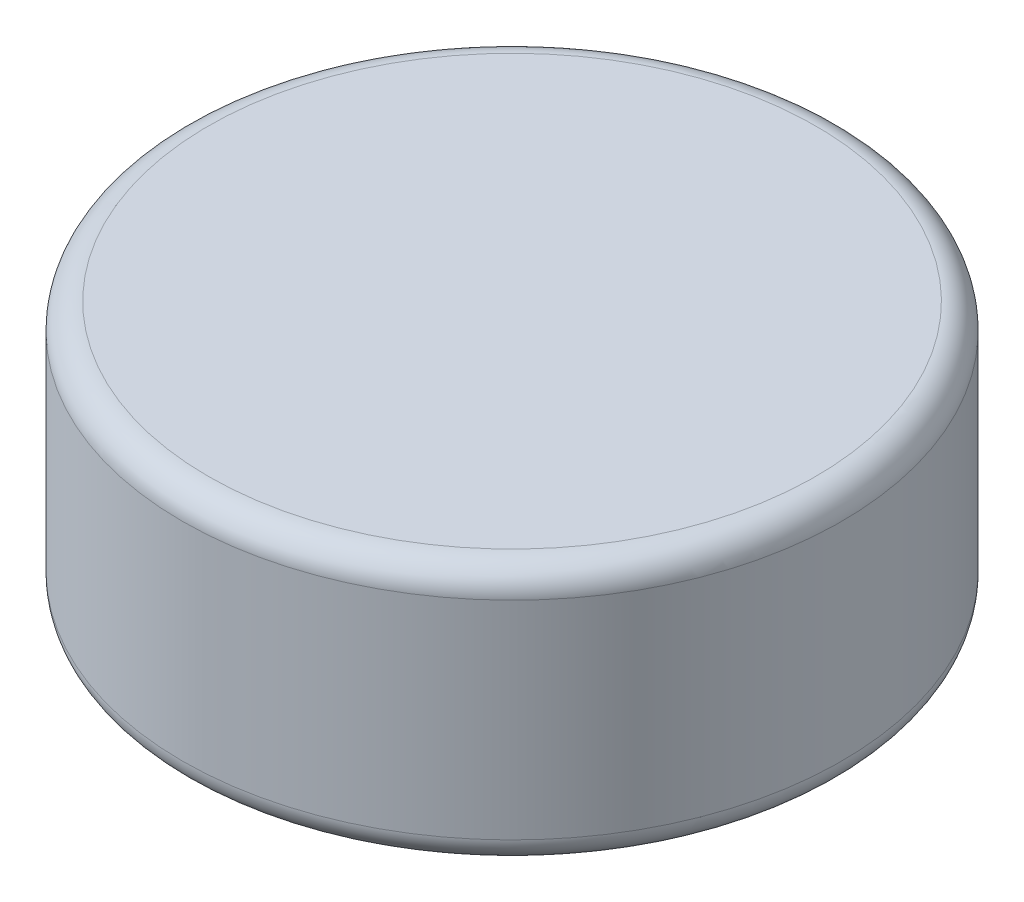
ISO-10303-21;
HEADER;
FILE_DESCRIPTION(('STEP AP214'),'2;1');
FILE_NAME('part.step','',(''),(''),'','','');
FILE_SCHEMA(('AUTOMOTIVE_DESIGN { 1 0 10303 214 1 1 1 1 }'));
ENDSEC;
DATA;
#1=APPLICATION_CONTEXT('core data for automotive mechanical design processes');
#2=APPLICATION_PROTOCOL_DEFINITION('international standard','automotive_design',2000,#1);
#3=PRODUCT_CONTEXT('',#1,'mechanical');
#4=PRODUCT('Part','Part','',(#3));
#5=PRODUCT_RELATED_PRODUCT_CATEGORY('part','',(#4));
#6=PRODUCT_DEFINITION_FORMATION('','',#4);
#7=PRODUCT_DEFINITION_CONTEXT('part definition',#1,'design');
#8=PRODUCT_DEFINITION('design','',#6,#7);
#9=PRODUCT_DEFINITION_SHAPE('','',#8);
#10=(LENGTH_UNIT() NAMED_UNIT(*) SI_UNIT(.MILLI.,.METRE.));
#11=(NAMED_UNIT(*) PLANE_ANGLE_UNIT() SI_UNIT($,.RADIAN.));
#12=(NAMED_UNIT(*) SI_UNIT($,.STERADIAN.) SOLID_ANGLE_UNIT());
#13=UNCERTAINTY_MEASURE_WITH_UNIT(LENGTH_MEASURE(1.E-05),#10,'distance_accuracy_value','');
#14=(GEOMETRIC_REPRESENTATION_CONTEXT(3) GLOBAL_UNCERTAINTY_ASSIGNED_CONTEXT((#13)) GLOBAL_UNIT_ASSIGNED_CONTEXT((#10,
#11,#12)) REPRESENTATION_CONTEXT('',''));
#15=CARTESIAN_POINT('',(0.,0.,0.));
#16=DIRECTION('',(0.,0.,1.));
#17=DIRECTION('',(1.,0.,0.));
#18=AXIS2_PLACEMENT_3D('',#15,#16,#17);
#19=CARTESIAN_POINT('',(0.,100.,0.));
#20=DIRECTION('',(0.,-1.,0.));
#21=DIRECTION('',(0.,0.,-1.));
#22=AXIS2_PLACEMENT_3D('',#19,#20,#21);
#23=CYLINDRICAL_SURFACE('',#22,127.);
#24=CARTESIAN_POINT('',(0.,9.99999999999999,0.));
#25=DIRECTION('',(0.,1.,0.));
#26=DIRECTION('',(0.,0.,1.));
#27=AXIS2_PLACEMENT_3D('',#24,#25,#26);
#28=CIRCLE('',#27,127.);
#29=CARTESIAN_POINT('',(0.,9.99999999999999,127.));
#30=VERTEX_POINT('',#29);
#31=EDGE_CURVE('E59',#30,#30,#28,.T.);
#32=ORIENTED_EDGE('',*,*,#31,.T.);
#33=EDGE_LOOP('',(#32));
#34=FACE_BOUND('',#33,.T.);
#35=CARTESIAN_POINT('',(0.,90.,0.));
#36=DIRECTION('',(0.,1.,0.));
#37=DIRECTION('',(0.,0.,1.));
#38=AXIS2_PLACEMENT_3D('',#35,#36,#37);
#39=CIRCLE('',#38,127.);
#40=CARTESIAN_POINT('',(0.,90.,127.));
#41=VERTEX_POINT('',#40);
#42=EDGE_CURVE('E62',#41,#41,#39,.F.);
#43=ORIENTED_EDGE('',*,*,#42,.T.);
#44=EDGE_LOOP('',(#43));
#45=FACE_BOUND('',#44,.T.);
#46=ADVANCED_FACE('F39',(#34,#45),#23,.T.);
#47=CARTESIAN_POINT('',(0.,100.,0.));
#48=DIRECTION('',(0.,1.,0.));
#49=DIRECTION('',(0.,0.,1.));
#50=AXIS2_PLACEMENT_3D('',#47,#48,#49);
#51=PLANE('',#50);
#52=CARTESIAN_POINT('',(0.,100.,0.));
#53=DIRECTION('',(0.,1.,0.));
#54=DIRECTION('',(0.,0.,1.));
#55=AXIS2_PLACEMENT_3D('',#52,#53,#54);
#56=CIRCLE('',#55,117.);
#57=CARTESIAN_POINT('',(0.,100.,117.));
#58=VERTEX_POINT('',#57);
#59=EDGE_CURVE('E50',#58,#58,#56,.T.);
#60=ORIENTED_EDGE('',*,*,#59,.T.);
#61=EDGE_LOOP('',(#60));
#62=FACE_BOUND('',#61,.T.);
#63=ADVANCED_FACE('F86',(#62),#51,.T.);
#64=CARTESIAN_POINT('',(0.,0.,0.));
#65=DIRECTION('',(0.,1.,0.));
#66=DIRECTION('',(0.,0.,1.));
#67=AXIS2_PLACEMENT_3D('',#64,#65,#66);
#68=PLANE('',#67);
#69=CARTESIAN_POINT('',(0.,0.,0.));
#70=DIRECTION('',(0.,1.,0.));
#71=DIRECTION('',(0.,0.,1.));
#72=AXIS2_PLACEMENT_3D('',#69,#70,#71);
#73=CIRCLE('',#72,74.5);
#74=CARTESIAN_POINT('',(0.,0.,74.5));
#75=VERTEX_POINT('',#74);
#76=EDGE_CURVE('E10',#75,#75,#73,.T.);
#77=ORIENTED_EDGE('',*,*,#76,.T.);
#78=EDGE_LOOP('',(#77));
#79=FACE_BOUND('',#78,.T.);
#80=CARTESIAN_POINT('',(0.,0.,0.));
#81=DIRECTION('',(0.,1.,0.));
#82=DIRECTION('',(0.,0.,1.));
#83=AXIS2_PLACEMENT_3D('',#80,#81,#82);
#84=CIRCLE('',#83,117.);
#85=CARTESIAN_POINT('',(0.,0.,117.));
#86=VERTEX_POINT('',#85);
#87=EDGE_CURVE('E54',#86,#86,#84,.F.);
#88=ORIENTED_EDGE('',*,*,#87,.T.);
#89=EDGE_LOOP('',(#88));
#90=FACE_BOUND('',#89,.T.);
#91=ADVANCED_FACE('F92',(#79,#90),#68,.F.);
#92=CARTESIAN_POINT('',(0.,9.99999999999999,0.));
#93=DIRECTION('',(0.,1.,0.));
#94=DIRECTION('',(0.,0.,1.));
#95=AXIS2_PLACEMENT_3D('',#92,#93,#94);
#96=TOROIDAL_SURFACE('',#95,117.,10.);
#97=ORIENTED_EDGE('',*,*,#87,.F.);
#98=EDGE_LOOP('',(#97));
#99=FACE_BOUND('',#98,.T.);
#100=ORIENTED_EDGE('',*,*,#31,.F.);
#101=EDGE_LOOP('',(#100));
#102=FACE_BOUND('',#101,.T.);
#103=ADVANCED_FACE('F82',(#99,#102),#96,.T.);
#104=CARTESIAN_POINT('',(0.,90.,0.));
#105=DIRECTION('',(0.,1.,0.));
#106=DIRECTION('',(0.,0.,1.));
#107=AXIS2_PLACEMENT_3D('',#104,#105,#106);
#108=TOROIDAL_SURFACE('',#107,117.,10.);
#109=ORIENTED_EDGE('',*,*,#42,.F.);
#110=EDGE_LOOP('',(#109));
#111=FACE_BOUND('',#110,.T.);
#112=ORIENTED_EDGE('',*,*,#59,.F.);
#113=EDGE_LOOP('',(#112));
#114=FACE_BOUND('',#113,.T.);
#115=ADVANCED_FACE('F73',(#111,#114),#108,.T.);
#116=CARTESIAN_POINT('',(0.,39.,0.));
#117=DIRECTION('',(0.,-1.,0.));
#118=DIRECTION('',(0.,0.,-1.));
#119=AXIS2_PLACEMENT_3D('',#116,#117,#118);
#120=CYLINDRICAL_SURFACE('',#119,64.5);
#121=CARTESIAN_POINT('',(0.,10.,0.));
#122=DIRECTION('',(0.,1.,0.));
#123=DIRECTION('',(0.,0.,1.));
#124=AXIS2_PLACEMENT_3D('',#121,#122,#123);
#125=CIRCLE('',#124,64.5);
#126=CARTESIAN_POINT('',(0.,10.,64.5));
#127=VERTEX_POINT('',#126);
#128=EDGE_CURVE('E46',#127,#127,#125,.F.);
#129=ORIENTED_EDGE('',*,*,#128,.T.);
#130=EDGE_LOOP('',(#129));
#131=FACE_BOUND('',#130,.T.);
#132=CARTESIAN_POINT('',(0.,39.,0.));
#133=DIRECTION('',(0.,-1.,0.));
#134=DIRECTION('',(0.,0.,-1.));
#135=AXIS2_PLACEMENT_3D('',#132,#133,#134);
#136=CIRCLE('',#135,64.5);
#137=CARTESIAN_POINT('',(0.,39.,-64.5));
#138=VERTEX_POINT('',#137);
#139=EDGE_CURVE('E65',#138,#138,#136,.T.);
#140=ORIENTED_EDGE('',*,*,#139,.F.);
#141=EDGE_LOOP('',(#140));
#142=FACE_BOUND('',#141,.T.);
#143=ADVANCED_FACE('F71',(#131,#142),#120,.F.);
#144=CARTESIAN_POINT('',(0.,39.,0.));
#145=DIRECTION('',(0.,-1.,0.));
#146=DIRECTION('',(0.,0.,-1.));
#147=AXIS2_PLACEMENT_3D('',#144,#145,#146);
#148=PLANE('',#147);
#149=ORIENTED_EDGE('',*,*,#139,.T.);
#150=EDGE_LOOP('',(#149));
#151=FACE_BOUND('',#150,.T.);
#152=ADVANCED_FACE('F69',(#151),#148,.T.);
#153=CARTESIAN_POINT('',(0.,10.,0.));
#154=DIRECTION('',(0.,1.,0.));
#155=DIRECTION('',(0.,0.,1.));
#156=AXIS2_PLACEMENT_3D('',#153,#154,#155);
#157=TOROIDAL_SURFACE('',#156,74.5,10.);
#158=ORIENTED_EDGE('',*,*,#76,.F.);
#159=EDGE_LOOP('',(#158));
#160=FACE_BOUND('',#159,.T.);
#161=ORIENTED_EDGE('',*,*,#128,.F.);
#162=EDGE_LOOP('',(#161));
#163=FACE_BOUND('',#162,.T.);
#164=ADVANCED_FACE('F41',(#160,#163),#157,.T.);
#165=CLOSED_SHELL('',(#46,#63,#91,#103,#115,#143,#152,#164));
#166=MANIFOLD_SOLID_BREP('B2',#165);
#167=ADVANCED_BREP_SHAPE_REPRESENTATION('',(#18,#166),#14);
#168=SHAPE_DEFINITION_REPRESENTATION(#9,#167);
ENDSEC;
END-ISO-10303-21;
